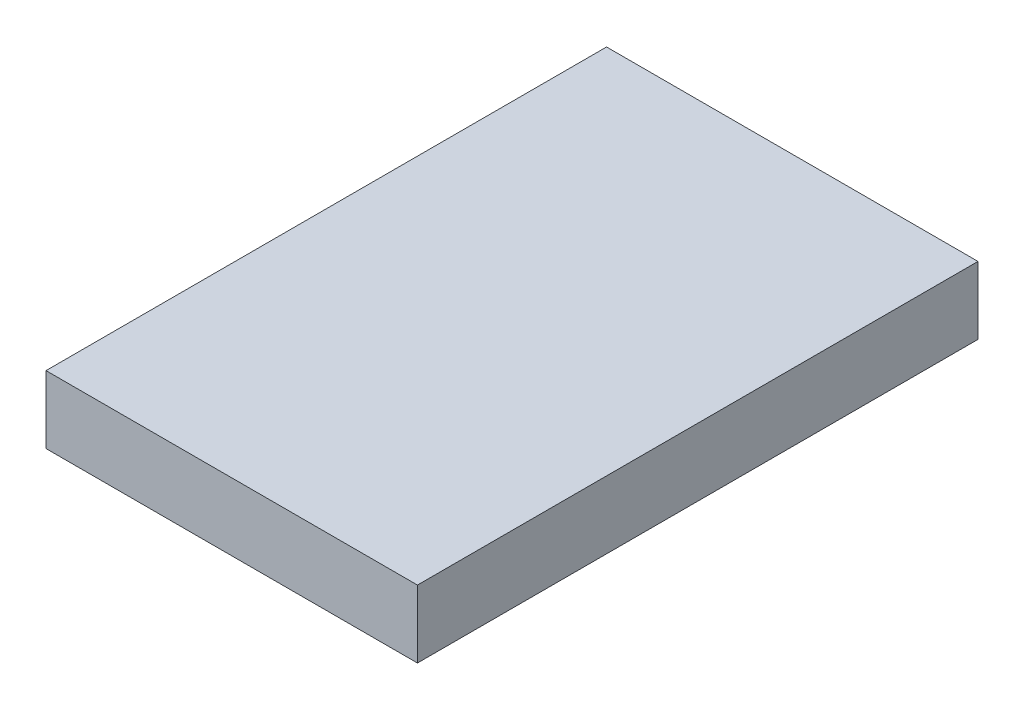
ISO-10303-21;
HEADER;
FILE_DESCRIPTION(('STEP AP214'),'2;1');
FILE_NAME('part.step','',(''),(''),'','','');
FILE_SCHEMA(('AUTOMOTIVE_DESIGN { 1 0 10303 214 1 1 1 1 }'));
ENDSEC;
DATA;
#1=APPLICATION_CONTEXT('core data for automotive mechanical design processes');
#2=APPLICATION_PROTOCOL_DEFINITION('international standard','automotive_design',2000,#1);
#3=PRODUCT_CONTEXT('',#1,'mechanical');
#4=PRODUCT('Part','Part','',(#3));
#5=PRODUCT_RELATED_PRODUCT_CATEGORY('part','',(#4));
#6=PRODUCT_DEFINITION_FORMATION('','',#4);
#7=PRODUCT_DEFINITION_CONTEXT('part definition',#1,'design');
#8=PRODUCT_DEFINITION('design','',#6,#7);
#9=PRODUCT_DEFINITION_SHAPE('','',#8);
#10=(LENGTH_UNIT() NAMED_UNIT(*) SI_UNIT(.MILLI.,.METRE.));
#11=(NAMED_UNIT(*) PLANE_ANGLE_UNIT() SI_UNIT($,.RADIAN.));
#12=(NAMED_UNIT(*) SI_UNIT($,.STERADIAN.) SOLID_ANGLE_UNIT());
#13=UNCERTAINTY_MEASURE_WITH_UNIT(LENGTH_MEASURE(1.E-05),#10,'distance_accuracy_value','');
#14=(GEOMETRIC_REPRESENTATION_CONTEXT(3) GLOBAL_UNCERTAINTY_ASSIGNED_CONTEXT((#13)) GLOBAL_UNIT_ASSIGNED_CONTEXT((#10,
#11,#12)) REPRESENTATION_CONTEXT('',''));
#15=CARTESIAN_POINT('',(0.,0.,0.));
#16=DIRECTION('',(0.,0.,1.));
#17=DIRECTION('',(1.,0.,0.));
#18=AXIS2_PLACEMENT_3D('',#15,#16,#17);
#19=CARTESIAN_POINT('',(27.5,10.,41.5));
#20=DIRECTION('',(-1.,0.,0.));
#21=DIRECTION('',(0.,0.,1.));
#22=AXIS2_PLACEMENT_3D('',#19,#20,#21);
#23=PLANE('',#22);
#24=DIRECTION('',(0.,0.,-1.));
#25=VECTOR('',#24,1.);
#26=CARTESIAN_POINT('',(27.5,0.,41.5));
#27=LINE('',#26,#25);
#28=CARTESIAN_POINT('',(27.5,0.,41.5));
#29=VERTEX_POINT('',#28);
#30=CARTESIAN_POINT('',(27.5,0.,-41.5));
#31=VERTEX_POINT('',#30);
#32=EDGE_CURVE('E107',#29,#31,#27,.T.);
#33=ORIENTED_EDGE('',*,*,#32,.T.);
#34=DIRECTION('',(0.,-1.,0.));
#35=VECTOR('',#34,1.);
#36=CARTESIAN_POINT('',(27.5,10.,-41.5));
#37=LINE('',#36,#35);
#38=CARTESIAN_POINT('',(27.5,10.,-41.5));
#39=VERTEX_POINT('',#38);
#40=EDGE_CURVE('E11',#39,#31,#37,.T.);
#41=ORIENTED_EDGE('',*,*,#40,.F.);
#42=DIRECTION('',(0.,0.,-1.));
#43=VECTOR('',#42,1.);
#44=CARTESIAN_POINT('',(27.5,10.,41.5));
#45=LINE('',#44,#43);
#46=CARTESIAN_POINT('',(27.5,10.,41.5));
#47=VERTEX_POINT('',#46);
#48=EDGE_CURVE('E91',#47,#39,#45,.T.);
#49=ORIENTED_EDGE('',*,*,#48,.F.);
#50=DIRECTION('',(0.,-1.,0.));
#51=VECTOR('',#50,1.);
#52=CARTESIAN_POINT('',(27.5,10.,41.5));
#53=LINE('',#52,#51);
#54=EDGE_CURVE('E103',#47,#29,#53,.T.);
#55=ORIENTED_EDGE('',*,*,#54,.T.);
#56=EDGE_LOOP('',(#33,#41,#49,#55));
#57=FACE_BOUND('',#56,.T.);
#58=ADVANCED_FACE('F39',(#57),#23,.F.);
#59=CARTESIAN_POINT('',(-27.5,10.,-41.5));
#60=DIRECTION('',(0.,0.,1.));
#61=DIRECTION('',(1.,0.,0.));
#62=AXIS2_PLACEMENT_3D('',#59,#60,#61);
#63=PLANE('',#62);
#64=DIRECTION('',(-1.,0.,0.));
#65=VECTOR('',#64,1.);
#66=CARTESIAN_POINT('',(-27.5,0.,-41.5));
#67=LINE('',#66,#65);
#68=CARTESIAN_POINT('',(-27.5,0.,-41.5));
#69=VERTEX_POINT('',#68);
#70=EDGE_CURVE('E96',#31,#69,#67,.T.);
#71=ORIENTED_EDGE('',*,*,#70,.T.);
#72=DIRECTION('',(0.,-1.,0.));
#73=VECTOR('',#72,1.);
#74=CARTESIAN_POINT('',(-27.5,10.,-41.5));
#75=LINE('',#74,#73);
#76=CARTESIAN_POINT('',(-27.5,10.,-41.5));
#77=VERTEX_POINT('',#76);
#78=EDGE_CURVE('E48',#77,#69,#75,.T.);
#79=ORIENTED_EDGE('',*,*,#78,.F.);
#80=DIRECTION('',(-1.,0.,0.));
#81=VECTOR('',#80,1.);
#82=CARTESIAN_POINT('',(-27.5,10.,-41.5));
#83=LINE('',#82,#81);
#84=EDGE_CURVE('E86',#39,#77,#83,.T.);
#85=ORIENTED_EDGE('',*,*,#84,.F.);
#86=ORIENTED_EDGE('',*,*,#40,.T.);
#87=EDGE_LOOP('',(#71,#79,#85,#86));
#88=FACE_BOUND('',#87,.T.);
#89=ADVANCED_FACE('F95',(#88),#63,.F.);
#90=CARTESIAN_POINT('',(-27.5,10.,41.5));
#91=DIRECTION('',(1.,0.,0.));
#92=DIRECTION('',(0.,0.,-1.));
#93=AXIS2_PLACEMENT_3D('',#90,#91,#92);
#94=PLANE('',#93);
#95=DIRECTION('',(0.,0.,1.));
#96=VECTOR('',#95,1.);
#97=CARTESIAN_POINT('',(-27.5,0.,41.5));
#98=LINE('',#97,#96);
#99=CARTESIAN_POINT('',(-27.5,0.,41.5));
#100=VERTEX_POINT('',#99);
#101=EDGE_CURVE('E73',#69,#100,#98,.T.);
#102=ORIENTED_EDGE('',*,*,#101,.T.);
#103=DIRECTION('',(0.,-1.,0.));
#104=VECTOR('',#103,1.);
#105=CARTESIAN_POINT('',(-27.5,10.,41.5));
#106=LINE('',#105,#104);
#107=CARTESIAN_POINT('',(-27.5,10.,41.5));
#108=VERTEX_POINT('',#107);
#109=EDGE_CURVE('E98',#108,#100,#106,.T.);
#110=ORIENTED_EDGE('',*,*,#109,.F.);
#111=DIRECTION('',(0.,0.,1.));
#112=VECTOR('',#111,1.);
#113=CARTESIAN_POINT('',(-27.5,10.,41.5));
#114=LINE('',#113,#112);
#115=EDGE_CURVE('E89',#77,#108,#114,.T.);
#116=ORIENTED_EDGE('',*,*,#115,.F.);
#117=ORIENTED_EDGE('',*,*,#78,.T.);
#118=EDGE_LOOP('',(#102,#110,#116,#117));
#119=FACE_BOUND('',#118,.T.);
#120=ADVANCED_FACE('F99',(#119),#94,.F.);
#121=CARTESIAN_POINT('',(-27.5,10.,41.5));
#122=DIRECTION('',(0.,0.,-1.));
#123=DIRECTION('',(-1.,0.,0.));
#124=AXIS2_PLACEMENT_3D('',#121,#122,#123);
#125=PLANE('',#124);
#126=DIRECTION('',(1.,0.,0.));
#127=VECTOR('',#126,1.);
#128=CARTESIAN_POINT('',(-27.5,0.,41.5));
#129=LINE('',#128,#127);
#130=EDGE_CURVE('E79',#100,#29,#129,.T.);
#131=ORIENTED_EDGE('',*,*,#130,.T.);
#132=ORIENTED_EDGE('',*,*,#54,.F.);
#133=DIRECTION('',(1.,0.,0.));
#134=VECTOR('',#133,1.);
#135=CARTESIAN_POINT('',(-27.5,10.,41.5));
#136=LINE('',#135,#134);
#137=EDGE_CURVE('E56',#108,#47,#136,.T.);
#138=ORIENTED_EDGE('',*,*,#137,.F.);
#139=ORIENTED_EDGE('',*,*,#109,.T.);
#140=EDGE_LOOP('',(#131,#132,#138,#139));
#141=FACE_BOUND('',#140,.T.);
#142=ADVANCED_FACE('F120',(#141),#125,.F.);
#143=CARTESIAN_POINT('',(0.,10.,0.));
#144=DIRECTION('',(0.,-1.,0.));
#145=DIRECTION('',(0.,0.,-1.));
#146=AXIS2_PLACEMENT_3D('',#143,#144,#145);
#147=PLANE('',#146);
#148=ORIENTED_EDGE('',*,*,#48,.T.);
#149=ORIENTED_EDGE('',*,*,#84,.T.);
#150=ORIENTED_EDGE('',*,*,#115,.T.);
#151=ORIENTED_EDGE('',*,*,#137,.T.);
#152=EDGE_LOOP('',(#148,#149,#150,#151));
#153=FACE_BOUND('',#152,.T.);
#154=ADVANCED_FACE('F87',(#153),#147,.F.);
#155=CARTESIAN_POINT('',(0.,0.,0.));
#156=DIRECTION('',(0.,-1.,0.));
#157=DIRECTION('',(0.,0.,-1.));
#158=AXIS2_PLACEMENT_3D('',#155,#156,#157);
#159=PLANE('',#158);
#160=ORIENTED_EDGE('',*,*,#32,.F.);
#161=ORIENTED_EDGE('',*,*,#130,.F.);
#162=ORIENTED_EDGE('',*,*,#101,.F.);
#163=ORIENTED_EDGE('',*,*,#70,.F.);
#164=EDGE_LOOP('',(#160,#161,#162,#163));
#165=FACE_BOUND('',#164,.T.);
#166=ADVANCED_FACE('F123',(#165),#159,.T.);
#167=CLOSED_SHELL('',(#58,#89,#120,#142,#154,#166));
#168=MANIFOLD_SOLID_BREP('B2',#167);
#169=ADVANCED_BREP_SHAPE_REPRESENTATION('',(#18,#168),#14);
#170=SHAPE_DEFINITION_REPRESENTATION(#9,#169);
ENDSEC;
END-ISO-10303-21;
